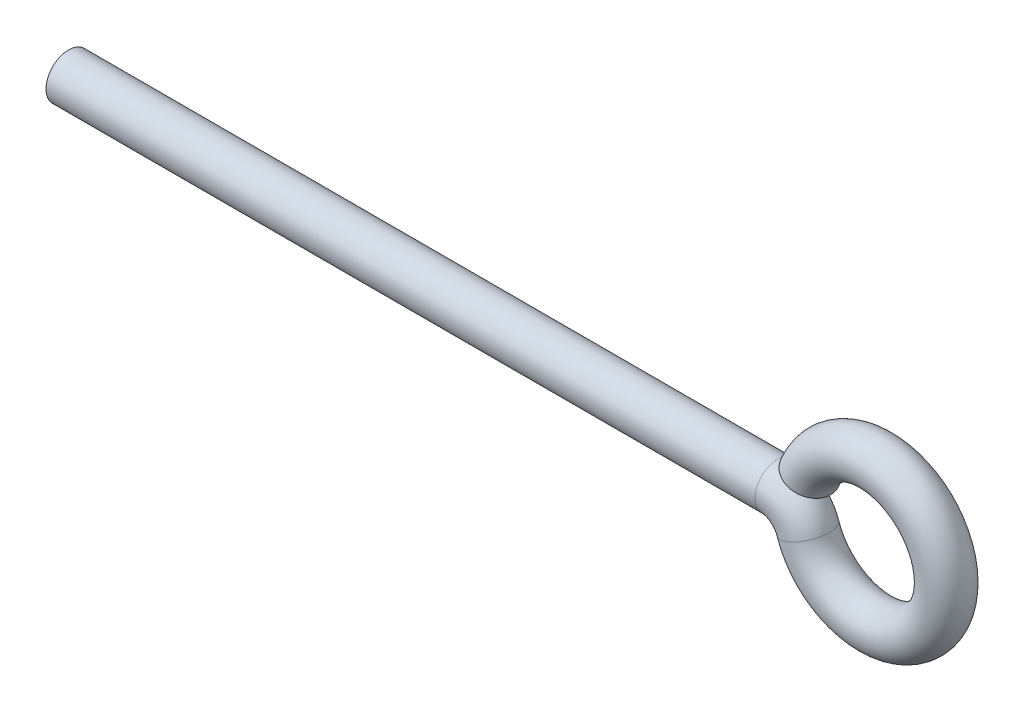
ISO-10303-21;
HEADER;
FILE_DESCRIPTION(('STEP AP214'),'2;1');
FILE_NAME('part.step','',(''),(''),'','','');
FILE_SCHEMA(('AUTOMOTIVE_DESIGN { 1 0 10303 214 1 1 1 1 }'));
ENDSEC;
DATA;
#1=APPLICATION_CONTEXT('core data for automotive mechanical design processes');
#2=APPLICATION_PROTOCOL_DEFINITION('international standard','automotive_design',2000,#1);
#3=PRODUCT_CONTEXT('',#1,'mechanical');
#4=PRODUCT('Part','Part','',(#3));
#5=PRODUCT_RELATED_PRODUCT_CATEGORY('part','',(#4));
#6=PRODUCT_DEFINITION_FORMATION('','',#4);
#7=PRODUCT_DEFINITION_CONTEXT('part definition',#1,'design');
#8=PRODUCT_DEFINITION('design','',#6,#7);
#9=PRODUCT_DEFINITION_SHAPE('','',#8);
#10=(LENGTH_UNIT() NAMED_UNIT(*) SI_UNIT(.MILLI.,.METRE.));
#11=(NAMED_UNIT(*) PLANE_ANGLE_UNIT() SI_UNIT($,.RADIAN.));
#12=(NAMED_UNIT(*) SI_UNIT($,.STERADIAN.) SOLID_ANGLE_UNIT());
#13=UNCERTAINTY_MEASURE_WITH_UNIT(LENGTH_MEASURE(1.E-05),#10,'distance_accuracy_value','');
#14=(GEOMETRIC_REPRESENTATION_CONTEXT(3) GLOBAL_UNCERTAINTY_ASSIGNED_CONTEXT((#13)) GLOBAL_UNIT_ASSIGNED_CONTEXT((#10,
#11,#12)) REPRESENTATION_CONTEXT('',''));
#15=CARTESIAN_POINT('',(0.,0.,0.));
#16=DIRECTION('',(0.,0.,1.));
#17=DIRECTION('',(1.,0.,0.));
#18=AXIS2_PLACEMENT_3D('',#15,#16,#17);
#19=CARTESIAN_POINT('',(0.,0.,0.));
#20=DIRECTION('',(-1.,0.,0.));
#21=DIRECTION('',(0.,-1.,0.));
#22=AXIS2_PLACEMENT_3D('',#19,#20,#21);
#23=PLANE('',#22);
#24=CARTESIAN_POINT('',(0.,0.,0.));
#25=DIRECTION('',(-1.,0.,0.));
#26=DIRECTION('',(0.,-1.,0.));
#27=AXIS2_PLACEMENT_3D('',#24,#25,#26);
#28=CIRCLE('',#27,3.175);
#29=CARTESIAN_POINT('',(0.,-3.17499999999998,0.));
#30=VERTEX_POINT('',#29);
#31=EDGE_CURVE('E70',#30,#30,#28,.T.);
#32=ORIENTED_EDGE('',*,*,#31,.T.);
#33=EDGE_LOOP('',(#32));
#34=FACE_BOUND('',#33,.T.);
#35=ADVANCED_FACE('F53',(#34),#23,.T.);
#36=CARTESIAN_POINT('',(104.539805378034,3.77037338788382,0.));
#37=DIRECTION('',(0.377037338788379,0.92619805935846,0.));
#38=DIRECTION('',(-0.92619805935846,0.377037338788379,0.));
#39=AXIS2_PLACEMENT_3D('',#36,#37,#38);
#40=PLANE('',#39);
#41=CARTESIAN_POINT('',(104.539805378034,3.77037338788382,0.));
#42=DIRECTION('',(0.377037338788379,0.92619805935846,0.));
#43=DIRECTION('',(-0.92619805935846,0.377037338788379,0.));
#44=AXIS2_PLACEMENT_3D('',#41,#42,#43);
#45=CIRCLE('',#44,3.175);
#46=CARTESIAN_POINT('',(101.599126539571,4.96746693853693,0.));
#47=VERTEX_POINT('',#46);
#48=EDGE_CURVE('E11',#47,#47,#45,.T.);
#49=ORIENTED_EDGE('',*,*,#48,.F.);
#50=EDGE_LOOP('',(#49));
#51=FACE_BOUND('',#50,.T.);
#52=ADVANCED_FACE('F81',(#51),#40,.F.);
#53=CARTESIAN_POINT('',(0.,0.,0.));
#54=DIRECTION('',(1.,0.,0.));
#55=DIRECTION('',(0.,0.,-1.));
#56=AXIS2_PLACEMENT_3D('',#53,#54,#55);
#57=CYLINDRICAL_SURFACE('',#56,3.175);
#58=CARTESIAN_POINT('',(100.,0.,0.));
#59=DIRECTION('',(-1.,0.,0.));
#60=DIRECTION('',(0.,-1.,0.));
#61=AXIS2_PLACEMENT_3D('',#58,#59,#60);
#62=CIRCLE('',#61,3.175);
#63=CARTESIAN_POINT('',(100.,3.17500000000001,0.));
#64=VERTEX_POINT('',#63);
#65=EDGE_CURVE('E65',#64,#64,#62,.T.);
#66=ORIENTED_EDGE('',*,*,#65,.T.);
#67=EDGE_LOOP('',(#66));
#68=FACE_BOUND('',#67,.T.);
#69=ORIENTED_EDGE('',*,*,#31,.F.);
#70=EDGE_LOOP('',(#69));
#71=FACE_BOUND('',#70,.T.);
#72=ADVANCED_FACE('F78',(#68,#71),#57,.T.);
#73=CARTESIAN_POINT('',(100.,-4.52446480031856,0.));
#74=DIRECTION('',(0.,0.,-1.));
#75=DIRECTION('',(-1.,0.,0.));
#76=AXIS2_PLACEMENT_3D('',#73,#74,#75);
#77=TOROIDAL_SURFACE('',#76,4.52446480031857,3.175);
#78=CARTESIAN_POINT('',(104.29934566737,-3.11506472873226,0.));
#79=DIRECTION('',(-0.31150647287323,0.950244030424859,0.));
#80=DIRECTION('',(-0.950244030424859,-0.31150647287323,0.));
#81=AXIS2_PLACEMENT_3D('',#78,#79,#80);
#82=CIRCLE('',#81,3.175);
#83=CARTESIAN_POINT('',(107.316370463969,-2.12603167735976,0.));
#84=VERTEX_POINT('',#83);
#85=EDGE_CURVE('E60',#84,#84,#82,.T.);
#86=CARTESIAN_POINT('',(100.,-4.52446480031856,0.));
#87=DIRECTION('',(0.,0.,-1.));
#88=DIRECTION('',(-1.,0.,0.));
#89=AXIS2_PLACEMENT_3D('',#86,#87,#88);
#90=CIRCLE('',#89,7.69946480031857);
#91=EDGE_CURVE('',#64,#84,#90,.T.);
#92=ORIENTED_EDGE('',*,*,#65,.F.);
#93=ORIENTED_EDGE('',*,*,#85,.T.);
#94=ORIENTED_EDGE('',*,*,#91,.T.);
#95=ORIENTED_EDGE('',*,*,#91,.F.);
#96=EDGE_LOOP('',(#92,#94,#93,#95));
#97=FACE_BOUND('',#96,.T.);
#98=ADVANCED_FACE('F80',(#97),#77,.T.);
#99=CARTESIAN_POINT('',(113.801785971619,0.,0.));
#100=DIRECTION('',(0.,0.,1.));
#101=DIRECTION('',(1.,0.,0.));
#102=AXIS2_PLACEMENT_3D('',#99,#100,#101);
#103=TOROIDAL_SURFACE('',#102,9.99999999999999,3.175);
#104=ORIENTED_EDGE('',*,*,#48,.T.);
#105=EDGE_LOOP('',(#104));
#106=FACE_BOUND('',#105,.T.);
#107=ORIENTED_EDGE('',*,*,#85,.F.);
#108=EDGE_LOOP('',(#107));
#109=FACE_BOUND('',#108,.T.);
#110=ADVANCED_FACE('F88',(#106,#109),#103,.T.);
#111=CLOSED_SHELL('',(#35,#52,#72,#98,#110));
#112=MANIFOLD_SOLID_BREP('B2',#111);
#113=ADVANCED_BREP_SHAPE_REPRESENTATION('',(#18,#112),#14);
#114=SHAPE_DEFINITION_REPRESENTATION(#9,#113);
ENDSEC;
END-ISO-10303-21;
